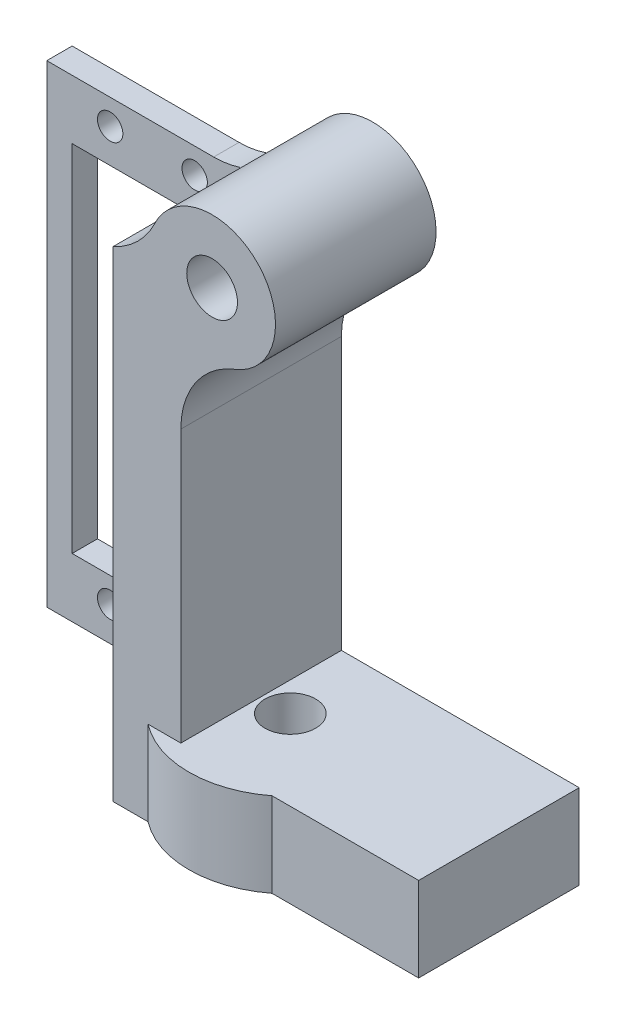
ISO-10303-21;
HEADER;
FILE_DESCRIPTION(('STEP AP214'),'2;1');
FILE_NAME('part.step','',(''),(''),'','','');
FILE_SCHEMA(('AUTOMOTIVE_DESIGN { 1 0 10303 214 1 1 1 1 }'));
ENDSEC;
DATA;
#1=APPLICATION_CONTEXT('core data for automotive mechanical design processes');
#2=APPLICATION_PROTOCOL_DEFINITION('international standard','automotive_design',2000,#1);
#3=PRODUCT_CONTEXT('',#1,'mechanical');
#4=PRODUCT('Part','Part','',(#3));
#5=PRODUCT_RELATED_PRODUCT_CATEGORY('part','',(#4));
#6=PRODUCT_DEFINITION_FORMATION('','',#4);
#7=PRODUCT_DEFINITION_CONTEXT('part definition',#1,'design');
#8=PRODUCT_DEFINITION('design','',#6,#7);
#9=PRODUCT_DEFINITION_SHAPE('','',#8);
#10=(LENGTH_UNIT() NAMED_UNIT(*) SI_UNIT(.MILLI.,.METRE.));
#11=(NAMED_UNIT(*) PLANE_ANGLE_UNIT() SI_UNIT($,.RADIAN.));
#12=(NAMED_UNIT(*) SI_UNIT($,.STERADIAN.) SOLID_ANGLE_UNIT());
#13=UNCERTAINTY_MEASURE_WITH_UNIT(LENGTH_MEASURE(1.E-05),#10,'distance_accuracy_value','');
#14=(GEOMETRIC_REPRESENTATION_CONTEXT(3) GLOBAL_UNCERTAINTY_ASSIGNED_CONTEXT((#13)) GLOBAL_UNIT_ASSIGNED_CONTEXT((#10,
#11,#12)) REPRESENTATION_CONTEXT('',''));
#15=CARTESIAN_POINT('',(0.,0.,0.));
#16=DIRECTION('',(0.,0.,1.));
#17=DIRECTION('',(1.,0.,0.));
#18=AXIS2_PLACEMENT_3D('',#15,#16,#17);
#19=CARTESIAN_POINT('',(0.,0.,19.));
#20=DIRECTION('',(0.,0.,1.));
#21=DIRECTION('',(1.,0.,0.));
#22=AXIS2_PLACEMENT_3D('',#19,#20,#21);
#23=PLANE('',#22);
#24=DIRECTION('',(0.,-1.,0.));
#25=VECTOR('',#24,1.);
#26=CARTESIAN_POINT('',(42.6496537676367,24.8744747806435,19.));
#27=LINE('',#26,#25);
#28=CARTESIAN_POINT('',(42.6496537676367,10.,19.));
#29=VERTEX_POINT('',#28);
#30=CARTESIAN_POINT('',(42.6496537676367,0.,19.));
#31=VERTEX_POINT('',#30);
#32=EDGE_CURVE('E378',#29,#31,#27,.T.);
#33=ORIENTED_EDGE('',*,*,#32,.T.);
#34=DIRECTION('',(1.,0.,0.));
#35=VECTOR('',#34,1.);
#36=CARTESIAN_POINT('',(23.8618670463647,0.,19.));
#37=LINE('',#36,#35);
#38=CARTESIAN_POINT('',(60.,0.,19.));
#39=VERTEX_POINT('',#38);
#40=EDGE_CURVE('E282',#31,#39,#37,.T.);
#41=ORIENTED_EDGE('',*,*,#40,.T.);
#42=DIRECTION('',(0.,1.,0.));
#43=VECTOR('',#42,1.);
#44=CARTESIAN_POINT('',(60.,10.,19.));
#45=LINE('',#44,#43);
#46=CARTESIAN_POINT('',(60.,10.,19.));
#47=VERTEX_POINT('',#46);
#48=EDGE_CURVE('E285',#39,#47,#45,.T.);
#49=ORIENTED_EDGE('',*,*,#48,.T.);
#50=DIRECTION('',(-1.,0.,0.));
#51=VECTOR('',#50,1.);
#52=CARTESIAN_POINT('',(60.,10.,19.));
#53=LINE('',#52,#51);
#54=EDGE_CURVE('E173',#47,#29,#53,.T.);
#55=ORIENTED_EDGE('',*,*,#54,.T.);
#56=EDGE_LOOP('',(#33,#41,#49,#55));
#57=FACE_BOUND('',#56,.T.);
#58=ADVANCED_FACE('F32',(#57),#23,.T.);
#59=CARTESIAN_POINT('',(0.,0.,3.));
#60=DIRECTION('',(0.,0.,-1.));
#61=DIRECTION('',(-1.,0.,0.));
#62=AXIS2_PLACEMENT_3D('',#59,#60,#61);
#63=PLANE('',#62);
#64=DIRECTION('',(1.,0.,0.));
#65=VECTOR('',#64,1.);
#66=CARTESIAN_POINT('',(0.,0.,3.));
#67=LINE('',#66,#65);
#68=CARTESIAN_POINT('',(0.,0.,3.));
#69=VERTEX_POINT('',#68);
#70=CARTESIAN_POINT('',(22.8618670463647,0.,3.));
#71=VERTEX_POINT('',#70);
#72=EDGE_CURVE('E340',#69,#71,#67,.T.);
#73=ORIENTED_EDGE('',*,*,#72,.T.);
#74=DIRECTION('',(0.,1.,0.));
#75=VECTOR('',#74,1.);
#76=CARTESIAN_POINT('',(22.8618670463647,56.8846373931819,3.));
#77=LINE('',#76,#75);
#78=CARTESIAN_POINT('',(22.8618670463647,6.99999999999999,3.));
#79=VERTEX_POINT('',#78);
#80=EDGE_CURVE('E200',#71,#79,#77,.T.);
#81=ORIENTED_EDGE('',*,*,#80,.T.);
#82=DIRECTION('',(1.,0.,0.));
#83=VECTOR('',#82,1.);
#84=CARTESIAN_POINT('',(3.,6.99999999999999,3.));
#85=LINE('',#84,#83);
#86=CARTESIAN_POINT('',(3.,6.99999999999999,3.));
#87=VERTEX_POINT('',#86);
#88=EDGE_CURVE('E317',#87,#79,#85,.T.);
#89=ORIENTED_EDGE('',*,*,#88,.F.);
#90=DIRECTION('',(0.,-1.,0.));
#91=VECTOR('',#90,1.);
#92=CARTESIAN_POINT('',(2.99999999999999,49.,3.));
#93=LINE('',#92,#91);
#94=CARTESIAN_POINT('',(2.99999999999999,49.,3.));
#95=VERTEX_POINT('',#94);
#96=EDGE_CURVE('E223',#95,#87,#93,.T.);
#97=ORIENTED_EDGE('',*,*,#96,.F.);
#98=DIRECTION('',(-1.,0.,0.));
#99=VECTOR('',#98,1.);
#100=CARTESIAN_POINT('',(2.99999999999999,49.,3.));
#101=LINE('',#100,#99);
#102=CARTESIAN_POINT('',(22.8618670463647,49.,3.));
#103=VERTEX_POINT('',#102);
#104=EDGE_CURVE('E210',#103,#95,#101,.T.);
#105=ORIENTED_EDGE('',*,*,#104,.F.);
#106=DIRECTION('',(0.,1.,0.));
#107=VECTOR('',#106,1.);
#108=CARTESIAN_POINT('',(22.8618670463647,56.8846373931819,3.));
#109=LINE('',#108,#107);
#110=CARTESIAN_POINT('',(22.8618670463647,56.4966200988257,3.));
#111=VERTEX_POINT('',#110);
#112=EDGE_CURVE('E193',#103,#111,#109,.T.);
#113=ORIENTED_EDGE('',*,*,#112,.T.);
#114=CARTESIAN_POINT('',(19.749670000232,66.,3.));
#115=DIRECTION('',(0.,0.,-1.));
#116=DIRECTION('',(-1.,0.,0.));
#117=AXIS2_PLACEMENT_3D('',#114,#115,#116);
#118=CIRCLE('',#117,10.);
#119=CARTESIAN_POINT('',(19.749670000232,56.,3.));
#120=VERTEX_POINT('',#119);
#121=EDGE_CURVE('E236',#111,#120,#118,.T.);
#122=ORIENTED_EDGE('',*,*,#121,.T.);
#123=DIRECTION('',(-1.,0.,0.));
#124=VECTOR('',#123,1.);
#125=CARTESIAN_POINT('',(0.,56.,3.));
#126=LINE('',#125,#124);
#127=CARTESIAN_POINT('',(0.,56.,3.));
#128=VERTEX_POINT('',#127);
#129=EDGE_CURVE('E343',#120,#128,#126,.T.);
#130=ORIENTED_EDGE('',*,*,#129,.T.);
#131=DIRECTION('',(0.,-1.,0.));
#132=VECTOR('',#131,1.);
#133=CARTESIAN_POINT('',(0.,0.,3.));
#134=LINE('',#133,#132);
#135=EDGE_CURVE('E337',#128,#69,#134,.T.);
#136=ORIENTED_EDGE('',*,*,#135,.T.);
#137=EDGE_LOOP('',(#73,#81,#89,#97,#105,#113,#122,#130,#136));
#138=FACE_BOUND('',#137,.T.);
#139=CARTESIAN_POINT('',(7.50000000000001,53.,3.));
#140=DIRECTION('',(0.,0.,1.));
#141=DIRECTION('',(1.,0.,0.));
#142=AXIS2_PLACEMENT_3D('',#139,#140,#141);
#143=CIRCLE('',#142,1.5);
#144=CARTESIAN_POINT('',(9.00000000000001,53.,3.));
#145=VERTEX_POINT('',#144);
#146=EDGE_CURVE('E301',#145,#145,#143,.T.);
#147=ORIENTED_EDGE('',*,*,#146,.F.);
#148=EDGE_LOOP('',(#147));
#149=FACE_BOUND('',#148,.T.);
#150=CARTESIAN_POINT('',(17.5,3.99999999999999,3.));
#151=DIRECTION('',(0.,0.,1.));
#152=DIRECTION('',(1.,0.,0.));
#153=AXIS2_PLACEMENT_3D('',#150,#151,#152);
#154=CIRCLE('',#153,1.5);
#155=CARTESIAN_POINT('',(19.,3.99999999999999,3.));
#156=VERTEX_POINT('',#155);
#157=EDGE_CURVE('E291',#156,#156,#154,.T.);
#158=ORIENTED_EDGE('',*,*,#157,.F.);
#159=EDGE_LOOP('',(#158));
#160=FACE_BOUND('',#159,.T.);
#161=CARTESIAN_POINT('',(7.50000000000001,4.00000000000001,3.));
#162=DIRECTION('',(0.,0.,1.));
#163=DIRECTION('',(1.,0.,0.));
#164=AXIS2_PLACEMENT_3D('',#161,#162,#163);
#165=CIRCLE('',#164,1.5);
#166=CARTESIAN_POINT('',(9.00000000000001,4.00000000000001,3.));
#167=VERTEX_POINT('',#166);
#168=EDGE_CURVE('E295',#167,#167,#165,.T.);
#169=ORIENTED_EDGE('',*,*,#168,.F.);
#170=EDGE_LOOP('',(#169));
#171=FACE_BOUND('',#170,.T.);
#172=CARTESIAN_POINT('',(17.5,53.,3.));
#173=DIRECTION('',(0.,0.,1.));
#174=DIRECTION('',(1.,0.,0.));
#175=AXIS2_PLACEMENT_3D('',#172,#173,#174);
#176=CIRCLE('',#175,1.5);
#177=CARTESIAN_POINT('',(19.,53.,3.));
#178=VERTEX_POINT('',#177);
#179=EDGE_CURVE('E302',#178,#178,#176,.T.);
#180=ORIENTED_EDGE('',*,*,#179,.F.);
#181=EDGE_LOOP('',(#180));
#182=FACE_BOUND('',#181,.T.);
#183=ADVANCED_FACE('F218',(#138,#149,#160,#171,#182),#63,.F.);
#184=CARTESIAN_POINT('',(0.,0.,0.));
#185=DIRECTION('',(0.,0.,-1.));
#186=DIRECTION('',(-1.,0.,0.));
#187=AXIS2_PLACEMENT_3D('',#184,#185,#186);
#188=PLANE('',#187);
#189=DIRECTION('',(-1.,0.,0.));
#190=VECTOR('',#189,1.);
#191=CARTESIAN_POINT('',(0.,56.,0.));
#192=LINE('',#191,#190);
#193=CARTESIAN_POINT('',(19.749670000232,56.,0.));
#194=VERTEX_POINT('',#193);
#195=CARTESIAN_POINT('',(0.,56.,0.));
#196=VERTEX_POINT('',#195);
#197=EDGE_CURVE('E341',#194,#196,#192,.T.);
#198=ORIENTED_EDGE('',*,*,#197,.F.);
#199=CARTESIAN_POINT('',(19.749670000232,66.,0.));
#200=DIRECTION('',(0.,0.,-1.));
#201=DIRECTION('',(-1.,0.,0.));
#202=AXIS2_PLACEMENT_3D('',#199,#200,#201);
#203=CIRCLE('',#202,10.);
#204=CARTESIAN_POINT('',(28.7847490292845,61.7142857142857,0.));
#205=VERTEX_POINT('',#204);
#206=EDGE_CURVE('E247',#194,#205,#203,.F.);
#207=ORIENTED_EDGE('',*,*,#206,.T.);
#208=CARTESIAN_POINT('',(35.5610583010739,58.5,0.));
#209=DIRECTION('',(0.,0.,-1.));
#210=DIRECTION('',(-1.,0.,0.));
#211=AXIS2_PLACEMENT_3D('',#208,#209,#210);
#212=CIRCLE('',#211,7.5);
#213=CARTESIAN_POINT('',(38.2614049061985,51.5029914811977,0.));
#214=VERTEX_POINT('',#213);
#215=EDGE_CURVE('E274',#205,#214,#212,.T.);
#216=ORIENTED_EDGE('',*,*,#215,.T.);
#217=CARTESIAN_POINT('',(41.8618670463647,42.1736467894613,0.));
#218=DIRECTION('',(0.,0.,-1.));
#219=DIRECTION('',(-1.,0.,0.));
#220=AXIS2_PLACEMENT_3D('',#217,#218,#219);
#221=CIRCLE('',#220,10.);
#222=CARTESIAN_POINT('',(31.8618670463647,42.1736467894613,0.));
#223=VERTEX_POINT('',#222);
#224=EDGE_CURVE('E190',#214,#223,#221,.F.);
#225=ORIENTED_EDGE('',*,*,#224,.T.);
#226=DIRECTION('',(0.,-1.,0.));
#227=VECTOR('',#226,1.);
#228=CARTESIAN_POINT('',(31.8618670463647,56.,0.));
#229=LINE('',#228,#227);
#230=CARTESIAN_POINT('',(31.8618670463647,10.,0.));
#231=VERTEX_POINT('',#230);
#232=EDGE_CURVE('E273',#223,#231,#229,.T.);
#233=ORIENTED_EDGE('',*,*,#232,.T.);
#234=DIRECTION('',(1.,0.,0.));
#235=VECTOR('',#234,1.);
#236=CARTESIAN_POINT('',(31.8618670463647,10.,0.));
#237=LINE('',#236,#235);
#238=CARTESIAN_POINT('',(60.,10.,0.));
#239=VERTEX_POINT('',#238);
#240=EDGE_CURVE('E182',#231,#239,#237,.T.);
#241=ORIENTED_EDGE('',*,*,#240,.T.);
#242=DIRECTION('',(0.,1.,0.));
#243=VECTOR('',#242,1.);
#244=CARTESIAN_POINT('',(60.,0.,0.));
#245=LINE('',#244,#243);
#246=CARTESIAN_POINT('',(60.,0.,0.));
#247=VERTEX_POINT('',#246);
#248=EDGE_CURVE('E350',#247,#239,#245,.T.);
#249=ORIENTED_EDGE('',*,*,#248,.F.);
#250=DIRECTION('',(1.,0.,0.));
#251=VECTOR('',#250,1.);
#252=CARTESIAN_POINT('',(0.,0.,0.));
#253=LINE('',#252,#251);
#254=CARTESIAN_POINT('',(0.,0.,0.));
#255=VERTEX_POINT('',#254);
#256=EDGE_CURVE('E348',#255,#247,#253,.T.);
#257=ORIENTED_EDGE('',*,*,#256,.F.);
#258=DIRECTION('',(0.,-1.,0.));
#259=VECTOR('',#258,1.);
#260=CARTESIAN_POINT('',(0.,0.,0.));
#261=LINE('',#260,#259);
#262=EDGE_CURVE('E336',#196,#255,#261,.T.);
#263=ORIENTED_EDGE('',*,*,#262,.F.);
#264=EDGE_LOOP('',(#198,#207,#216,#225,#233,#241,#249,#257,#263));
#265=FACE_BOUND('',#264,.T.);
#266=CARTESIAN_POINT('',(17.5,53.,0.));
#267=DIRECTION('',(0.,0.,1.));
#268=DIRECTION('',(1.,0.,0.));
#269=AXIS2_PLACEMENT_3D('',#266,#267,#268);
#270=CIRCLE('',#269,1.5);
#271=CARTESIAN_POINT('',(19.,53.,0.));
#272=VERTEX_POINT('',#271);
#273=EDGE_CURVE('E298',#272,#272,#270,.T.);
#274=ORIENTED_EDGE('',*,*,#273,.T.);
#275=EDGE_LOOP('',(#274));
#276=FACE_BOUND('',#275,.T.);
#277=CARTESIAN_POINT('',(7.50000000000001,4.00000000000001,0.));
#278=DIRECTION('',(0.,0.,1.));
#279=DIRECTION('',(1.,0.,0.));
#280=AXIS2_PLACEMENT_3D('',#277,#278,#279);
#281=CIRCLE('',#280,1.5);
#282=CARTESIAN_POINT('',(9.00000000000001,4.00000000000001,0.));
#283=VERTEX_POINT('',#282);
#284=EDGE_CURVE('E305',#283,#283,#281,.T.);
#285=ORIENTED_EDGE('',*,*,#284,.T.);
#286=EDGE_LOOP('',(#285));
#287=FACE_BOUND('',#286,.T.);
#288=CARTESIAN_POINT('',(17.5,3.99999999999999,0.));
#289=DIRECTION('',(0.,0.,1.));
#290=DIRECTION('',(1.,0.,0.));
#291=AXIS2_PLACEMENT_3D('',#288,#289,#290);
#292=CIRCLE('',#291,1.5);
#293=CARTESIAN_POINT('',(19.,3.99999999999999,0.));
#294=VERTEX_POINT('',#293);
#295=EDGE_CURVE('E292',#294,#294,#292,.T.);
#296=ORIENTED_EDGE('',*,*,#295,.T.);
#297=EDGE_LOOP('',(#296));
#298=FACE_BOUND('',#297,.T.);
#299=CARTESIAN_POINT('',(7.50000000000001,53.,0.));
#300=DIRECTION('',(0.,0.,1.));
#301=DIRECTION('',(1.,0.,0.));
#302=AXIS2_PLACEMENT_3D('',#299,#300,#301);
#303=CIRCLE('',#302,1.5);
#304=CARTESIAN_POINT('',(9.00000000000001,53.,0.));
#305=VERTEX_POINT('',#304);
#306=EDGE_CURVE('E310',#305,#305,#303,.T.);
#307=ORIENTED_EDGE('',*,*,#306,.T.);
#308=EDGE_LOOP('',(#307));
#309=FACE_BOUND('',#308,.T.);
#310=DIRECTION('',(1.,0.,0.));
#311=VECTOR('',#310,1.);
#312=CARTESIAN_POINT('',(3.,6.99999999999999,0.));
#313=LINE('',#312,#311);
#314=CARTESIAN_POINT('',(3.,6.99999999999999,0.));
#315=VERTEX_POINT('',#314);
#316=CARTESIAN_POINT('',(23.,6.99999999999999,0.));
#317=VERTEX_POINT('',#316);
#318=EDGE_CURVE('E224',#315,#317,#313,.T.);
#319=ORIENTED_EDGE('',*,*,#318,.T.);
#320=DIRECTION('',(0.,1.,0.));
#321=VECTOR('',#320,1.);
#322=CARTESIAN_POINT('',(23.,49.,0.));
#323=LINE('',#322,#321);
#324=CARTESIAN_POINT('',(23.,49.,0.));
#325=VERTEX_POINT('',#324);
#326=EDGE_CURVE('E313',#317,#325,#323,.T.);
#327=ORIENTED_EDGE('',*,*,#326,.T.);
#328=DIRECTION('',(-1.,0.,0.));
#329=VECTOR('',#328,1.);
#330=CARTESIAN_POINT('',(2.99999999999999,49.,0.));
#331=LINE('',#330,#329);
#332=CARTESIAN_POINT('',(2.99999999999999,49.,0.));
#333=VERTEX_POINT('',#332);
#334=EDGE_CURVE('E322',#325,#333,#331,.T.);
#335=ORIENTED_EDGE('',*,*,#334,.T.);
#336=DIRECTION('',(0.,-1.,0.));
#337=VECTOR('',#336,1.);
#338=CARTESIAN_POINT('',(2.99999999999999,49.,0.));
#339=LINE('',#338,#337);
#340=EDGE_CURVE('E325',#333,#315,#339,.T.);
#341=ORIENTED_EDGE('',*,*,#340,.T.);
#342=EDGE_LOOP('',(#319,#327,#335,#341));
#343=FACE_BOUND('',#342,.T.);
#344=CARTESIAN_POINT('',(35.5610583010739,58.5,0.));
#345=DIRECTION('',(0.,0.,-1.));
#346=DIRECTION('',(-1.,0.,0.));
#347=AXIS2_PLACEMENT_3D('',#344,#345,#346);
#348=CIRCLE('',#347,3.);
#349=CARTESIAN_POINT('',(32.5610583010739,58.5,0.));
#350=VERTEX_POINT('',#349);
#351=EDGE_CURVE('E264',#350,#350,#348,.T.);
#352=ORIENTED_EDGE('',*,*,#351,.F.);
#353=EDGE_LOOP('',(#352));
#354=FACE_BOUND('',#353,.T.);
#355=ADVANCED_FACE('F271',(#265,#276,#287,#298,#309,#343,#354),#188,.T.);
#356=CARTESIAN_POINT('',(0.,0.,3.));
#357=DIRECTION('',(1.,0.,0.));
#358=DIRECTION('',(0.,0.,-1.));
#359=AXIS2_PLACEMENT_3D('',#356,#357,#358);
#360=PLANE('',#359);
#361=ORIENTED_EDGE('',*,*,#262,.T.);
#362=DIRECTION('',(0.,0.,-1.));
#363=VECTOR('',#362,1.);
#364=CARTESIAN_POINT('',(0.,0.,3.));
#365=LINE('',#364,#363);
#366=EDGE_CURVE('E359',#69,#255,#365,.T.);
#367=ORIENTED_EDGE('',*,*,#366,.F.);
#368=ORIENTED_EDGE('',*,*,#135,.F.);
#369=DIRECTION('',(0.,0.,-1.));
#370=VECTOR('',#369,1.);
#371=CARTESIAN_POINT('',(0.,56.,3.));
#372=LINE('',#371,#370);
#373=EDGE_CURVE('E345',#128,#196,#372,.T.);
#374=ORIENTED_EDGE('',*,*,#373,.T.);
#375=EDGE_LOOP('',(#361,#367,#368,#374));
#376=FACE_BOUND('',#375,.T.);
#377=ADVANCED_FACE('F393',(#376),#360,.F.);
#378=CARTESIAN_POINT('',(0.,0.,3.));
#379=DIRECTION('',(0.,1.,0.));
#380=DIRECTION('',(0.,0.,1.));
#381=AXIS2_PLACEMENT_3D('',#378,#379,#380);
#382=PLANE('',#381);
#383=CARTESIAN_POINT('',(35.3182146183291,0.,9.5));
#384=DIRECTION('',(0.,-1.,0.));
#385=DIRECTION('',(0.,0.,-1.));
#386=AXIS2_PLACEMENT_3D('',#383,#384,#385);
#387=CIRCLE('',#386,3.);
#388=CARTESIAN_POINT('',(35.3182146183291,0.,6.5));
#389=VERTEX_POINT('',#388);
#390=EDGE_CURVE('E381',#389,#389,#387,.T.);
#391=ORIENTED_EDGE('',*,*,#390,.F.);
#392=EDGE_LOOP('',(#391));
#393=FACE_BOUND('',#392,.T.);
#394=ORIENTED_EDGE('',*,*,#256,.T.);
#395=DIRECTION('',(0.,0.,-1.));
#396=VECTOR('',#395,1.);
#397=CARTESIAN_POINT('',(60.,0.,3.));
#398=LINE('',#397,#396);
#399=EDGE_CURVE('E356',#39,#247,#398,.T.);
#400=ORIENTED_EDGE('',*,*,#399,.F.);
#401=ORIENTED_EDGE('',*,*,#40,.F.);
#402=CARTESIAN_POINT('',(35.3182146183291,0.,9.5));
#403=DIRECTION('',(0.,-1.,0.));
#404=DIRECTION('',(0.,0.,-1.));
#405=AXIS2_PLACEMENT_3D('',#402,#403,#404);
#406=CIRCLE('',#405,12.);
#407=CARTESIAN_POINT('',(27.9867754690215,0.,19.));
#408=VERTEX_POINT('',#407);
#409=EDGE_CURVE('E372',#31,#408,#406,.T.);
#410=ORIENTED_EDGE('',*,*,#409,.T.);
#411=CARTESIAN_POINT('',(23.8618670463647,0.,19.));
#412=VERTEX_POINT('',#411);
#413=EDGE_CURVE('E283',#412,#408,#37,.T.);
#414=ORIENTED_EDGE('',*,*,#413,.F.);
#415=DIRECTION('',(0.,0.,-1.));
#416=VECTOR('',#415,1.);
#417=CARTESIAN_POINT('',(23.8618670463647,0.,19.));
#418=LINE('',#417,#416);
#419=CARTESIAN_POINT('',(23.8618670463647,0.,4.00000000000002));
#420=VERTEX_POINT('',#419);
#421=EDGE_CURVE('E289',#412,#420,#418,.T.);
#422=ORIENTED_EDGE('',*,*,#421,.T.);
#423=DIRECTION('',(0.707106781186544,0.,0.707106781186551));
#424=VECTOR('',#423,1.);
#425=CARTESIAN_POINT('',(11.4309335231824,0.,-8.43093352318233));
#426=LINE('',#425,#424);
#427=EDGE_CURVE('E202',#420,#71,#426,.F.);
#428=ORIENTED_EDGE('',*,*,#427,.T.);
#429=ORIENTED_EDGE('',*,*,#72,.F.);
#430=ORIENTED_EDGE('',*,*,#366,.T.);
#431=EDGE_LOOP('',(#394,#400,#401,#410,#414,#422,#428,#429,#430));
#432=FACE_BOUND('',#431,.T.);
#433=ADVANCED_FACE('F368',(#393,#432),#382,.F.);
#434=CARTESIAN_POINT('',(60.,0.,3.));
#435=DIRECTION('',(-1.,0.,0.));
#436=DIRECTION('',(0.,0.,1.));
#437=AXIS2_PLACEMENT_3D('',#434,#435,#436);
#438=PLANE('',#437);
#439=ORIENTED_EDGE('',*,*,#248,.T.);
#440=DIRECTION('',(0.,0.,-1.));
#441=VECTOR('',#440,1.);
#442=CARTESIAN_POINT('',(60.,10.,19.));
#443=LINE('',#442,#441);
#444=EDGE_CURVE('E183',#47,#239,#443,.T.);
#445=ORIENTED_EDGE('',*,*,#444,.F.);
#446=ORIENTED_EDGE('',*,*,#48,.F.);
#447=ORIENTED_EDGE('',*,*,#399,.T.);
#448=EDGE_LOOP('',(#439,#445,#446,#447));
#449=FACE_BOUND('',#448,.T.);
#450=ADVANCED_FACE('F456',(#449),#438,.F.);
#451=CARTESIAN_POINT('',(0.,56.,3.));
#452=DIRECTION('',(0.,-1.,0.));
#453=DIRECTION('',(0.,0.,-1.));
#454=AXIS2_PLACEMENT_3D('',#451,#452,#453);
#455=PLANE('',#454);
#456=ORIENTED_EDGE('',*,*,#129,.F.);
#457=DIRECTION('',(0.,0.,-1.));
#458=VECTOR('',#457,1.);
#459=CARTESIAN_POINT('',(19.749670000232,56.,3.));
#460=LINE('',#459,#458);
#461=EDGE_CURVE('E362',#120,#194,#460,.T.);
#462=ORIENTED_EDGE('',*,*,#461,.T.);
#463=ORIENTED_EDGE('',*,*,#197,.T.);
#464=ORIENTED_EDGE('',*,*,#373,.F.);
#465=EDGE_LOOP('',(#456,#462,#463,#464));
#466=FACE_BOUND('',#465,.T.);
#467=ADVANCED_FACE('F452',(#466),#455,.F.);
#468=CARTESIAN_POINT('',(23.,49.,3.));
#469=DIRECTION('',(-1.,0.,0.));
#470=DIRECTION('',(0.,0.,1.));
#471=AXIS2_PLACEMENT_3D('',#468,#469,#470);
#472=PLANE('',#471);
#473=ORIENTED_EDGE('',*,*,#326,.F.);
#474=DIRECTION('',(0.,0.,-1.));
#475=VECTOR('',#474,1.);
#476=CARTESIAN_POINT('',(23.,6.99999999999999,3.));
#477=LINE('',#476,#475);
#478=CARTESIAN_POINT('',(23.,6.99999999999999,3.13813295363534));
#479=VERTEX_POINT('',#478);
#480=EDGE_CURVE('E54',#479,#317,#477,.T.);
#481=ORIENTED_EDGE('',*,*,#480,.F.);
#482=DIRECTION('',(0.,-1.,0.));
#483=VECTOR('',#482,1.);
#484=CARTESIAN_POINT('',(23.,56.,3.13813295363534));
#485=LINE('',#484,#483);
#486=CARTESIAN_POINT('',(23.,49.,3.13813295363534));
#487=VERTEX_POINT('',#486);
#488=EDGE_CURVE('E206',#479,#487,#485,.F.);
#489=ORIENTED_EDGE('',*,*,#488,.T.);
#490=DIRECTION('',(0.,0.,-1.));
#491=VECTOR('',#490,1.);
#492=CARTESIAN_POINT('',(23.,49.,3.));
#493=LINE('',#492,#491);
#494=EDGE_CURVE('E47',#487,#325,#493,.T.);
#495=ORIENTED_EDGE('',*,*,#494,.T.);
#496=EDGE_LOOP('',(#473,#481,#489,#495));
#497=FACE_BOUND('',#496,.T.);
#498=ADVANCED_FACE('F450',(#497),#472,.T.);
#499=CARTESIAN_POINT('',(2.99999999999999,49.,3.));
#500=DIRECTION('',(0.,-1.,0.));
#501=DIRECTION('',(0.,0.,-1.));
#502=AXIS2_PLACEMENT_3D('',#499,#500,#501);
#503=PLANE('',#502);
#504=ORIENTED_EDGE('',*,*,#334,.F.);
#505=ORIENTED_EDGE('',*,*,#494,.F.);
#506=DIRECTION('',(0.707106781186544,0.,0.707106781186551));
#507=VECTOR('',#506,1.);
#508=CARTESIAN_POINT('',(23.8618670463647,49.,4.00000000000002));
#509=LINE('',#508,#507);
#510=EDGE_CURVE('E40',#487,#103,#509,.F.);
#511=ORIENTED_EDGE('',*,*,#510,.T.);
#512=ORIENTED_EDGE('',*,*,#104,.T.);
#513=DIRECTION('',(0.,0.,-1.));
#514=VECTOR('',#513,1.);
#515=CARTESIAN_POINT('',(2.99999999999999,49.,3.));
#516=LINE('',#515,#514);
#517=EDGE_CURVE('E333',#95,#333,#516,.T.);
#518=ORIENTED_EDGE('',*,*,#517,.T.);
#519=EDGE_LOOP('',(#504,#505,#511,#512,#518));
#520=FACE_BOUND('',#519,.T.);
#521=ADVANCED_FACE('F209',(#520),#503,.T.);
#522=CARTESIAN_POINT('',(2.99999999999999,49.,3.));
#523=DIRECTION('',(1.,0.,0.));
#524=DIRECTION('',(0.,1.,0.));
#525=AXIS2_PLACEMENT_3D('',#522,#523,#524);
#526=PLANE('',#525);
#527=ORIENTED_EDGE('',*,*,#340,.F.);
#528=ORIENTED_EDGE('',*,*,#517,.F.);
#529=ORIENTED_EDGE('',*,*,#96,.T.);
#530=DIRECTION('',(0.,0.,-1.));
#531=VECTOR('',#530,1.);
#532=CARTESIAN_POINT('',(3.,6.99999999999999,3.));
#533=LINE('',#532,#531);
#534=EDGE_CURVE('E331',#87,#315,#533,.T.);
#535=ORIENTED_EDGE('',*,*,#534,.T.);
#536=EDGE_LOOP('',(#527,#528,#529,#535));
#537=FACE_BOUND('',#536,.T.);
#538=ADVANCED_FACE('F443',(#537),#526,.T.);
#539=CARTESIAN_POINT('',(3.,6.99999999999999,3.));
#540=DIRECTION('',(0.,1.,0.));
#541=DIRECTION('',(0.,0.,1.));
#542=AXIS2_PLACEMENT_3D('',#539,#540,#541);
#543=PLANE('',#542);
#544=ORIENTED_EDGE('',*,*,#318,.F.);
#545=ORIENTED_EDGE('',*,*,#534,.F.);
#546=ORIENTED_EDGE('',*,*,#88,.T.);
#547=DIRECTION('',(-0.707106781186544,0.,-0.707106781186551));
#548=VECTOR('',#547,1.);
#549=CARTESIAN_POINT('',(23.8618670463647,6.99999999999999,4.00000000000002));
#550=LINE('',#549,#548);
#551=EDGE_CURVE('E204',#79,#479,#550,.F.);
#552=ORIENTED_EDGE('',*,*,#551,.T.);
#553=ORIENTED_EDGE('',*,*,#480,.T.);
#554=EDGE_LOOP('',(#544,#545,#546,#552,#553));
#555=FACE_BOUND('',#554,.T.);
#556=ADVANCED_FACE('F439',(#555),#543,.T.);
#557=CARTESIAN_POINT('',(7.50000000000001,53.,0.));
#558=DIRECTION('',(0.,0.,1.));
#559=DIRECTION('',(1.,0.,0.));
#560=AXIS2_PLACEMENT_3D('',#557,#558,#559);
#561=CYLINDRICAL_SURFACE('',#560,1.5);
#562=ORIENTED_EDGE('',*,*,#306,.F.);
#563=EDGE_LOOP('',(#562));
#564=FACE_BOUND('',#563,.T.);
#565=ORIENTED_EDGE('',*,*,#146,.T.);
#566=EDGE_LOOP('',(#565));
#567=FACE_BOUND('',#566,.T.);
#568=ADVANCED_FACE('F429',(#564,#567),#561,.F.);
#569=CARTESIAN_POINT('',(17.5,3.99999999999999,0.));
#570=DIRECTION('',(0.,0.,1.));
#571=DIRECTION('',(1.,0.,0.));
#572=AXIS2_PLACEMENT_3D('',#569,#570,#571);
#573=CYLINDRICAL_SURFACE('',#572,1.5);
#574=ORIENTED_EDGE('',*,*,#295,.F.);
#575=EDGE_LOOP('',(#574));
#576=FACE_BOUND('',#575,.T.);
#577=ORIENTED_EDGE('',*,*,#157,.T.);
#578=EDGE_LOOP('',(#577));
#579=FACE_BOUND('',#578,.T.);
#580=ADVANCED_FACE('F425',(#576,#579),#573,.F.);
#581=CARTESIAN_POINT('',(7.50000000000001,4.00000000000001,0.));
#582=DIRECTION('',(0.,0.,1.));
#583=DIRECTION('',(1.,0.,0.));
#584=AXIS2_PLACEMENT_3D('',#581,#582,#583);
#585=CYLINDRICAL_SURFACE('',#584,1.5);
#586=ORIENTED_EDGE('',*,*,#284,.F.);
#587=EDGE_LOOP('',(#586));
#588=FACE_BOUND('',#587,.T.);
#589=ORIENTED_EDGE('',*,*,#168,.T.);
#590=EDGE_LOOP('',(#589));
#591=FACE_BOUND('',#590,.T.);
#592=ADVANCED_FACE('F428',(#588,#591),#585,.F.);
#593=CARTESIAN_POINT('',(17.5,53.,0.));
#594=DIRECTION('',(0.,0.,1.));
#595=DIRECTION('',(1.,0.,0.));
#596=AXIS2_PLACEMENT_3D('',#593,#594,#595);
#597=CYLINDRICAL_SURFACE('',#596,1.5);
#598=ORIENTED_EDGE('',*,*,#273,.F.);
#599=EDGE_LOOP('',(#598));
#600=FACE_BOUND('',#599,.T.);
#601=ORIENTED_EDGE('',*,*,#179,.T.);
#602=EDGE_LOOP('',(#601));
#603=FACE_BOUND('',#602,.T.);
#604=ADVANCED_FACE('F424',(#600,#603),#597,.F.);
#605=CARTESIAN_POINT('',(23.8618670463647,56.,19.));
#606=DIRECTION('',(1.,0.,0.));
#607=DIRECTION('',(0.,0.,-1.));
#608=AXIS2_PLACEMENT_3D('',#605,#606,#607);
#609=PLANE('',#608);
#610=DIRECTION('',(0.,0.,-1.));
#611=VECTOR('',#610,1.);
#612=CARTESIAN_POINT('',(23.8618670463647,56.8846373931819,19.));
#613=LINE('',#612,#611);
#614=CARTESIAN_POINT('',(23.8618670463647,56.8846373931819,19.));
#615=VERTEX_POINT('',#614);
#616=CARTESIAN_POINT('',(23.8618670463647,56.8846373931819,4.00000000000002));
#617=VERTEX_POINT('',#616);
#618=EDGE_CURVE('E234',#615,#617,#613,.T.);
#619=ORIENTED_EDGE('',*,*,#618,.T.);
#620=DIRECTION('',(0.,-1.,0.));
#621=VECTOR('',#620,1.);
#622=CARTESIAN_POINT('',(23.8618670463647,0.,4.00000000000002));
#623=LINE('',#622,#621);
#624=EDGE_CURVE('E189',#617,#420,#623,.T.);
#625=ORIENTED_EDGE('',*,*,#624,.T.);
#626=ORIENTED_EDGE('',*,*,#421,.F.);
#627=DIRECTION('',(0.,-1.,0.));
#628=VECTOR('',#627,1.);
#629=CARTESIAN_POINT('',(23.8618670463647,56.,19.));
#630=LINE('',#629,#628);
#631=EDGE_CURVE('E242',#615,#412,#630,.T.);
#632=ORIENTED_EDGE('',*,*,#631,.F.);
#633=EDGE_LOOP('',(#619,#625,#626,#632));
#634=FACE_BOUND('',#633,.T.);
#635=ADVANCED_FACE('F238',(#634),#609,.F.);
#636=CARTESIAN_POINT('',(60.,10.,19.));
#637=DIRECTION('',(0.,-1.,0.));
#638=DIRECTION('',(1.,0.,0.));
#639=AXIS2_PLACEMENT_3D('',#636,#637,#638);
#640=PLANE('',#639);
#641=CARTESIAN_POINT('',(35.3182146183291,10.,9.5));
#642=DIRECTION('',(0.,-1.,0.));
#643=DIRECTION('',(1.,0.,0.));
#644=AXIS2_PLACEMENT_3D('',#641,#642,#643);
#645=CIRCLE('',#644,3.);
#646=CARTESIAN_POINT('',(38.3182146183291,10.,9.5));
#647=VERTEX_POINT('',#646);
#648=EDGE_CURVE('E376',#647,#647,#645,.F.);
#649=ORIENTED_EDGE('',*,*,#648,.F.);
#650=EDGE_LOOP('',(#649));
#651=FACE_BOUND('',#650,.T.);
#652=ORIENTED_EDGE('',*,*,#444,.T.);
#653=ORIENTED_EDGE('',*,*,#240,.F.);
#654=DIRECTION('',(0.,0.,-1.));
#655=VECTOR('',#654,1.);
#656=CARTESIAN_POINT('',(31.8618670463647,10.,19.));
#657=LINE('',#656,#655);
#658=CARTESIAN_POINT('',(31.8618670463647,10.,19.));
#659=VERTEX_POINT('',#658);
#660=EDGE_CURVE('E167',#659,#231,#657,.T.);
#661=ORIENTED_EDGE('',*,*,#660,.F.);
#662=DIRECTION('',(1.,0.,0.));
#663=VECTOR('',#662,1.);
#664=CARTESIAN_POINT('',(0.,9.99999999999999,19.));
#665=LINE('',#664,#663);
#666=CARTESIAN_POINT('',(27.9867754690215,10.,19.));
#667=VERTEX_POINT('',#666);
#668=EDGE_CURVE('E179',#667,#659,#665,.T.);
#669=ORIENTED_EDGE('',*,*,#668,.F.);
#670=CARTESIAN_POINT('',(35.3182146183291,10.,9.5));
#671=DIRECTION('',(0.,-1.,0.));
#672=DIRECTION('',(1.,0.,0.));
#673=AXIS2_PLACEMENT_3D('',#670,#671,#672);
#674=CIRCLE('',#673,12.);
#675=EDGE_CURVE('E265',#667,#29,#674,.F.);
#676=ORIENTED_EDGE('',*,*,#675,.T.);
#677=ORIENTED_EDGE('',*,*,#54,.F.);
#678=EDGE_LOOP('',(#652,#653,#661,#669,#676,#677));
#679=FACE_BOUND('',#678,.T.);
#680=ADVANCED_FACE('F177',(#651,#679),#640,.F.);
#681=CARTESIAN_POINT('',(31.8618670463647,56.,19.));
#682=DIRECTION('',(-1.,0.,0.));
#683=DIRECTION('',(0.,-1.,0.));
#684=AXIS2_PLACEMENT_3D('',#681,#682,#683);
#685=PLANE('',#684);
#686=ORIENTED_EDGE('',*,*,#232,.F.);
#687=DIRECTION('',(0.,0.,-1.));
#688=VECTOR('',#687,1.);
#689=CARTESIAN_POINT('',(31.8618670463647,42.1736467894613,19.));
#690=LINE('',#689,#688);
#691=CARTESIAN_POINT('',(31.8618670463647,42.1736467894613,19.));
#692=VERTEX_POINT('',#691);
#693=EDGE_CURVE('E170',#223,#692,#690,.F.);
#694=ORIENTED_EDGE('',*,*,#693,.T.);
#695=DIRECTION('',(0.,1.,0.));
#696=VECTOR('',#695,1.);
#697=CARTESIAN_POINT('',(31.8618670463647,56.,19.));
#698=LINE('',#697,#696);
#699=EDGE_CURVE('E163',#659,#692,#698,.T.);
#700=ORIENTED_EDGE('',*,*,#699,.F.);
#701=ORIENTED_EDGE('',*,*,#660,.T.);
#702=EDGE_LOOP('',(#686,#694,#700,#701));
#703=FACE_BOUND('',#702,.T.);
#704=ADVANCED_FACE('F166',(#703),#685,.F.);
#705=DIRECTION('',(0.,-1.,0.));
#706=VECTOR('',#705,1.);
#707=CARTESIAN_POINT('',(27.9867754690215,24.8744747806435,19.));
#708=LINE('',#707,#706);
#709=EDGE_CURVE('E188',#667,#408,#708,.T.);
#710=ORIENTED_EDGE('',*,*,#709,.F.);
#711=ORIENTED_EDGE('',*,*,#668,.T.);
#712=ORIENTED_EDGE('',*,*,#699,.T.);
#713=CARTESIAN_POINT('',(41.8618670463647,42.1736467894613,19.));
#714=DIRECTION('',(0.,0.,1.));
#715=DIRECTION('',(1.,0.,0.));
#716=AXIS2_PLACEMENT_3D('',#713,#714,#715);
#717=CIRCLE('',#716,10.);
#718=CARTESIAN_POINT('',(38.2614049061985,51.5029914811977,19.));
#719=VERTEX_POINT('',#718);
#720=EDGE_CURVE('E195',#692,#719,#717,.F.);
#721=ORIENTED_EDGE('',*,*,#720,.T.);
#722=CARTESIAN_POINT('',(35.5610583010739,58.5,19.));
#723=DIRECTION('',(0.,0.,1.));
#724=DIRECTION('',(1.,0.,0.));
#725=AXIS2_PLACEMENT_3D('',#722,#723,#724);
#726=CIRCLE('',#725,7.5);
#727=CARTESIAN_POINT('',(28.7847490292845,61.7142857142857,19.));
#728=VERTEX_POINT('',#727);
#729=EDGE_CURVE('E255',#728,#719,#726,.F.);
#730=ORIENTED_EDGE('',*,*,#729,.F.);
#731=CARTESIAN_POINT('',(19.749670000232,66.,19.));
#732=DIRECTION('',(0.,0.,1.));
#733=DIRECTION('',(1.,0.,0.));
#734=AXIS2_PLACEMENT_3D('',#731,#732,#733);
#735=CIRCLE('',#734,10.);
#736=EDGE_CURVE('E244',#728,#615,#735,.F.);
#737=ORIENTED_EDGE('',*,*,#736,.T.);
#738=ORIENTED_EDGE('',*,*,#631,.T.);
#739=ORIENTED_EDGE('',*,*,#413,.T.);
#740=EDGE_LOOP('',(#710,#711,#712,#721,#730,#737,#738,#739));
#741=FACE_BOUND('',#740,.T.);
#742=CARTESIAN_POINT('',(35.5610583010739,58.5,19.));
#743=DIRECTION('',(0.,0.,1.));
#744=DIRECTION('',(1.,0.,0.));
#745=AXIS2_PLACEMENT_3D('',#742,#743,#744);
#746=CIRCLE('',#745,3.);
#747=CARTESIAN_POINT('',(38.5610583010739,58.5,19.));
#748=VERTEX_POINT('',#747);
#749=EDGE_CURVE('E275',#748,#748,#746,.F.);
#750=ORIENTED_EDGE('',*,*,#749,.T.);
#751=EDGE_LOOP('',(#750));
#752=FACE_BOUND('',#751,.T.);
#753=ADVANCED_FACE('F185',(#741,#752),#23,.T.);
#754=CARTESIAN_POINT('',(35.5610583010739,58.5,40.2132034355964));
#755=DIRECTION('',(0.,0.,-1.));
#756=DIRECTION('',(-1.,0.,0.));
#757=AXIS2_PLACEMENT_3D('',#754,#755,#756);
#758=CYLINDRICAL_SURFACE('',#757,7.5);
#759=ORIENTED_EDGE('',*,*,#729,.T.);
#760=DIRECTION('',(0.,0.,-1.));
#761=VECTOR('',#760,1.);
#762=CARTESIAN_POINT('',(38.2614049061985,51.5029914811977,40.2132034355964));
#763=LINE('',#762,#761);
#764=EDGE_CURVE('E252',#719,#214,#763,.T.);
#765=ORIENTED_EDGE('',*,*,#764,.T.);
#766=ORIENTED_EDGE('',*,*,#215,.F.);
#767=DIRECTION('',(0.,0.,-1.));
#768=VECTOR('',#767,1.);
#769=CARTESIAN_POINT('',(28.7847490292845,61.7142857142857,40.2132034355964));
#770=LINE('',#769,#768);
#771=EDGE_CURVE('E263',#205,#728,#770,.F.);
#772=ORIENTED_EDGE('',*,*,#771,.T.);
#773=EDGE_LOOP('',(#759,#765,#766,#772));
#774=FACE_BOUND('',#773,.T.);
#775=ADVANCED_FACE('F259',(#774),#758,.T.);
#776=CARTESIAN_POINT('',(35.5610583010739,58.5,40.2132034355964));
#777=DIRECTION('',(0.,0.,-1.));
#778=DIRECTION('',(-1.,0.,0.));
#779=AXIS2_PLACEMENT_3D('',#776,#777,#778);
#780=CYLINDRICAL_SURFACE('',#779,3.);
#781=ORIENTED_EDGE('',*,*,#351,.T.);
#782=EDGE_LOOP('',(#781));
#783=FACE_BOUND('',#782,.T.);
#784=ORIENTED_EDGE('',*,*,#749,.F.);
#785=EDGE_LOOP('',(#784));
#786=FACE_BOUND('',#785,.T.);
#787=ADVANCED_FACE('F389',(#783,#786),#780,.F.);
#788=CARTESIAN_POINT('',(19.749670000232,66.,40.2132034355964));
#789=DIRECTION('',(0.,0.,-1.));
#790=DIRECTION('',(-1.,0.,0.));
#791=AXIS2_PLACEMENT_3D('',#788,#789,#790);
#792=CYLINDRICAL_SURFACE('',#791,10.);
#793=ORIENTED_EDGE('',*,*,#736,.F.);
#794=ORIENTED_EDGE('',*,*,#771,.F.);
#795=ORIENTED_EDGE('',*,*,#206,.F.);
#796=ORIENTED_EDGE('',*,*,#461,.F.);
#797=ORIENTED_EDGE('',*,*,#121,.F.);
#798=CARTESIAN_POINT('',(19.749670000232,66.,-0.112197046132682));
#799=DIRECTION('',(-0.707106781186551,0.,0.707106781186544));
#800=DIRECTION('',(-0.707106781186544,0.,-0.707106781186551));
#801=AXIS2_PLACEMENT_3D('',#798,#799,#800);
#802=ELLIPSE('',#801,14.142135623731,10.);
#803=EDGE_CURVE('E11',#111,#617,#802,.T.);
#804=ORIENTED_EDGE('',*,*,#803,.T.);
#805=ORIENTED_EDGE('',*,*,#618,.F.);
#806=EDGE_LOOP('',(#793,#794,#795,#796,#797,#804,#805));
#807=FACE_BOUND('',#806,.T.);
#808=ADVANCED_FACE('F233',(#807),#792,.F.);
#809=CARTESIAN_POINT('',(41.8618670463647,42.1736467894613,40.2132034355964));
#810=DIRECTION('',(0.,0.,-1.));
#811=DIRECTION('',(-1.,0.,0.));
#812=AXIS2_PLACEMENT_3D('',#809,#810,#811);
#813=CYLINDRICAL_SURFACE('',#812,10.);
#814=ORIENTED_EDGE('',*,*,#224,.F.);
#815=ORIENTED_EDGE('',*,*,#764,.F.);
#816=ORIENTED_EDGE('',*,*,#720,.F.);
#817=ORIENTED_EDGE('',*,*,#693,.F.);
#818=EDGE_LOOP('',(#814,#815,#816,#817));
#819=FACE_BOUND('',#818,.T.);
#820=ADVANCED_FACE('F268',(#819),#813,.F.);
#821=CARTESIAN_POINT('',(35.3182146183291,24.8744747806435,9.5));
#822=DIRECTION('',(0.,-1.,0.));
#823=DIRECTION('',(0.,0.,-1.));
#824=AXIS2_PLACEMENT_3D('',#821,#822,#823);
#825=CYLINDRICAL_SURFACE('',#824,12.);
#826=ORIENTED_EDGE('',*,*,#675,.F.);
#827=ORIENTED_EDGE('',*,*,#709,.T.);
#828=ORIENTED_EDGE('',*,*,#409,.F.);
#829=ORIENTED_EDGE('',*,*,#32,.F.);
#830=EDGE_LOOP('',(#826,#827,#828,#829));
#831=FACE_BOUND('',#830,.T.);
#832=ADVANCED_FACE('F470',(#831),#825,.T.);
#833=CARTESIAN_POINT('',(35.3182146183291,18.4852813742386,9.5));
#834=DIRECTION('',(0.,-1.,0.));
#835=DIRECTION('',(0.,0.,-1.));
#836=AXIS2_PLACEMENT_3D('',#833,#834,#835);
#837=CYLINDRICAL_SURFACE('',#836,3.);
#838=ORIENTED_EDGE('',*,*,#648,.T.);
#839=EDGE_LOOP('',(#838));
#840=FACE_BOUND('',#839,.T.);
#841=ORIENTED_EDGE('',*,*,#390,.T.);
#842=EDGE_LOOP('',(#841));
#843=FACE_BOUND('',#842,.T.);
#844=ADVANCED_FACE('F472',(#840,#843),#837,.F.);
#845=CARTESIAN_POINT('',(23.8618670463647,56.,4.00000000000002));
#846=DIRECTION('',(-0.707106781186551,0.,0.707106781186544));
#847=DIRECTION('',(0.,1.,0.));
#848=AXIS2_PLACEMENT_3D('',#845,#846,#847);
#849=PLANE('',#848);
#850=ORIENTED_EDGE('',*,*,#551,.F.);
#851=ORIENTED_EDGE('',*,*,#80,.F.);
#852=ORIENTED_EDGE('',*,*,#427,.F.);
#853=ORIENTED_EDGE('',*,*,#624,.F.);
#854=ORIENTED_EDGE('',*,*,#803,.F.);
#855=ORIENTED_EDGE('',*,*,#112,.F.);
#856=ORIENTED_EDGE('',*,*,#510,.F.);
#857=ORIENTED_EDGE('',*,*,#488,.F.);
#858=EDGE_LOOP('',(#850,#851,#852,#853,#854,#855,#856,#857));
#859=FACE_BOUND('',#858,.T.);
#860=ADVANCED_FACE('F34',(#859),#849,.T.);
#861=CLOSED_SHELL('',(#58,#183,#355,#377,#433,#450,#467,#498,#521,#538,#556,#568,#580,#592,#604,
#635,#680,#704,#753,#775,#787,#808,#820,#832,#844,#860));
#862=MANIFOLD_SOLID_BREP('B2',#861);
#863=ADVANCED_BREP_SHAPE_REPRESENTATION('',(#18,#862),#14);
#864=SHAPE_DEFINITION_REPRESENTATION(#9,#863);
ENDSEC;
END-ISO-10303-21;
